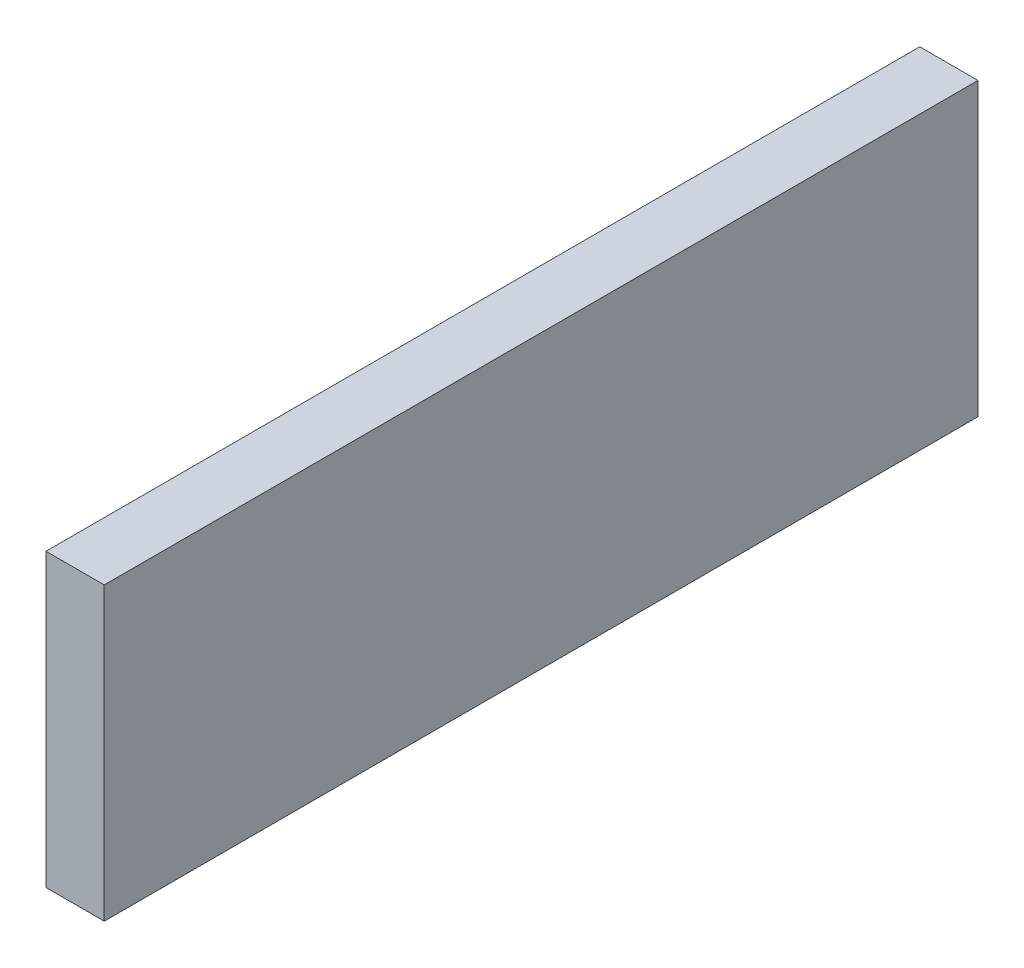
ISO-10303-21;
HEADER;
FILE_DESCRIPTION(('STEP AP214'),'2;1');
FILE_NAME('part.step','',(''),(''),'','','');
FILE_SCHEMA(('AUTOMOTIVE_DESIGN { 1 0 10303 214 1 1 1 1 }'));
ENDSEC;
DATA;
#1=APPLICATION_CONTEXT('core data for automotive mechanical design processes');
#2=APPLICATION_PROTOCOL_DEFINITION('international standard','automotive_design',2000,#1);
#3=PRODUCT_CONTEXT('',#1,'mechanical');
#4=PRODUCT('Part','Part','',(#3));
#5=PRODUCT_RELATED_PRODUCT_CATEGORY('part','',(#4));
#6=PRODUCT_DEFINITION_FORMATION('','',#4);
#7=PRODUCT_DEFINITION_CONTEXT('part definition',#1,'design');
#8=PRODUCT_DEFINITION('design','',#6,#7);
#9=PRODUCT_DEFINITION_SHAPE('','',#8);
#10=(LENGTH_UNIT() NAMED_UNIT(*) SI_UNIT(.MILLI.,.METRE.));
#11=(NAMED_UNIT(*) PLANE_ANGLE_UNIT() SI_UNIT($,.RADIAN.));
#12=(NAMED_UNIT(*) SI_UNIT($,.STERADIAN.) SOLID_ANGLE_UNIT());
#13=UNCERTAINTY_MEASURE_WITH_UNIT(LENGTH_MEASURE(1.E-05),#10,'distance_accuracy_value','');
#14=(GEOMETRIC_REPRESENTATION_CONTEXT(3) GLOBAL_UNCERTAINTY_ASSIGNED_CONTEXT((#13)) GLOBAL_UNIT_ASSIGNED_CONTEXT((#10,
#11,#12)) REPRESENTATION_CONTEXT('',''));
#15=CARTESIAN_POINT('',(0.,0.,0.));
#16=DIRECTION('',(0.,0.,1.));
#17=DIRECTION('',(1.,0.,0.));
#18=AXIS2_PLACEMENT_3D('',#15,#16,#17);
#19=CARTESIAN_POINT('',(0.,100.,0.));
#20=DIRECTION('',(1.,0.,0.));
#21=DIRECTION('',(0.,0.,-1.));
#22=AXIS2_PLACEMENT_3D('',#19,#20,#21);
#23=PLANE('',#22);
#24=DIRECTION('',(0.,0.,1.));
#25=VECTOR('',#24,1.);
#26=CARTESIAN_POINT('',(0.,0.,0.));
#27=LINE('',#26,#25);
#28=CARTESIAN_POINT('',(0.,0.,0.));
#29=VERTEX_POINT('',#28);
#30=CARTESIAN_POINT('',(0.,0.,300.));
#31=VERTEX_POINT('',#30);
#32=EDGE_CURVE('E107',#29,#31,#27,.T.);
#33=ORIENTED_EDGE('',*,*,#32,.T.);
#34=DIRECTION('',(0.,-1.,0.));
#35=VECTOR('',#34,1.);
#36=CARTESIAN_POINT('',(0.,100.,300.));
#37=LINE('',#36,#35);
#38=CARTESIAN_POINT('',(0.,100.,300.));
#39=VERTEX_POINT('',#38);
#40=EDGE_CURVE('E11',#39,#31,#37,.T.);
#41=ORIENTED_EDGE('',*,*,#40,.F.);
#42=DIRECTION('',(0.,0.,1.));
#43=VECTOR('',#42,1.);
#44=CARTESIAN_POINT('',(0.,100.,0.));
#45=LINE('',#44,#43);
#46=CARTESIAN_POINT('',(0.,100.,0.));
#47=VERTEX_POINT('',#46);
#48=EDGE_CURVE('E91',#47,#39,#45,.T.);
#49=ORIENTED_EDGE('',*,*,#48,.F.);
#50=DIRECTION('',(0.,-1.,0.));
#51=VECTOR('',#50,1.);
#52=CARTESIAN_POINT('',(0.,100.,0.));
#53=LINE('',#52,#51);
#54=EDGE_CURVE('E103',#47,#29,#53,.T.);
#55=ORIENTED_EDGE('',*,*,#54,.T.);
#56=EDGE_LOOP('',(#33,#41,#49,#55));
#57=FACE_BOUND('',#56,.T.);
#58=ADVANCED_FACE('F39',(#57),#23,.F.);
#59=CARTESIAN_POINT('',(0.,100.,300.));
#60=DIRECTION('',(0.,0.,-1.));
#61=DIRECTION('',(-1.,0.,0.));
#62=AXIS2_PLACEMENT_3D('',#59,#60,#61);
#63=PLANE('',#62);
#64=DIRECTION('',(1.,0.,0.));
#65=VECTOR('',#64,1.);
#66=CARTESIAN_POINT('',(0.,0.,300.));
#67=LINE('',#66,#65);
#68=CARTESIAN_POINT('',(20.0000000000001,0.,300.));
#69=VERTEX_POINT('',#68);
#70=EDGE_CURVE('E96',#31,#69,#67,.T.);
#71=ORIENTED_EDGE('',*,*,#70,.T.);
#72=DIRECTION('',(0.,-1.,0.));
#73=VECTOR('',#72,1.);
#74=CARTESIAN_POINT('',(20.0000000000001,100.,300.));
#75=LINE('',#74,#73);
#76=CARTESIAN_POINT('',(20.0000000000001,100.,300.));
#77=VERTEX_POINT('',#76);
#78=EDGE_CURVE('E48',#77,#69,#75,.T.);
#79=ORIENTED_EDGE('',*,*,#78,.F.);
#80=DIRECTION('',(1.,0.,0.));
#81=VECTOR('',#80,1.);
#82=CARTESIAN_POINT('',(0.,100.,300.));
#83=LINE('',#82,#81);
#84=EDGE_CURVE('E86',#39,#77,#83,.T.);
#85=ORIENTED_EDGE('',*,*,#84,.F.);
#86=ORIENTED_EDGE('',*,*,#40,.T.);
#87=EDGE_LOOP('',(#71,#79,#85,#86));
#88=FACE_BOUND('',#87,.T.);
#89=ADVANCED_FACE('F95',(#88),#63,.F.);
#90=CARTESIAN_POINT('',(20.,100.,0.));
#91=DIRECTION('',(-1.,0.,0.));
#92=DIRECTION('',(0.,0.,1.));
#93=AXIS2_PLACEMENT_3D('',#90,#91,#92);
#94=PLANE('',#93);
#95=DIRECTION('',(0.,0.,-1.));
#96=VECTOR('',#95,1.);
#97=CARTESIAN_POINT('',(20.,0.,0.));
#98=LINE('',#97,#96);
#99=CARTESIAN_POINT('',(20.,0.,0.));
#100=VERTEX_POINT('',#99);
#101=EDGE_CURVE('E73',#69,#100,#98,.T.);
#102=ORIENTED_EDGE('',*,*,#101,.T.);
#103=DIRECTION('',(0.,-1.,0.));
#104=VECTOR('',#103,1.);
#105=CARTESIAN_POINT('',(20.,100.,0.));
#106=LINE('',#105,#104);
#107=CARTESIAN_POINT('',(20.,100.,0.));
#108=VERTEX_POINT('',#107);
#109=EDGE_CURVE('E98',#108,#100,#106,.T.);
#110=ORIENTED_EDGE('',*,*,#109,.F.);
#111=DIRECTION('',(0.,0.,-1.));
#112=VECTOR('',#111,1.);
#113=CARTESIAN_POINT('',(20.,100.,0.));
#114=LINE('',#113,#112);
#115=EDGE_CURVE('E89',#77,#108,#114,.T.);
#116=ORIENTED_EDGE('',*,*,#115,.F.);
#117=ORIENTED_EDGE('',*,*,#78,.T.);
#118=EDGE_LOOP('',(#102,#110,#116,#117));
#119=FACE_BOUND('',#118,.T.);
#120=ADVANCED_FACE('F99',(#119),#94,.F.);
#121=CARTESIAN_POINT('',(0.,100.,0.));
#122=DIRECTION('',(0.,0.,1.));
#123=DIRECTION('',(1.,0.,0.));
#124=AXIS2_PLACEMENT_3D('',#121,#122,#123);
#125=PLANE('',#124);
#126=DIRECTION('',(-1.,0.,0.));
#127=VECTOR('',#126,1.);
#128=CARTESIAN_POINT('',(0.,0.,0.));
#129=LINE('',#128,#127);
#130=EDGE_CURVE('E79',#100,#29,#129,.T.);
#131=ORIENTED_EDGE('',*,*,#130,.T.);
#132=ORIENTED_EDGE('',*,*,#54,.F.);
#133=DIRECTION('',(-1.,0.,0.));
#134=VECTOR('',#133,1.);
#135=CARTESIAN_POINT('',(0.,100.,0.));
#136=LINE('',#135,#134);
#137=EDGE_CURVE('E56',#108,#47,#136,.T.);
#138=ORIENTED_EDGE('',*,*,#137,.F.);
#139=ORIENTED_EDGE('',*,*,#109,.T.);
#140=EDGE_LOOP('',(#131,#132,#138,#139));
#141=FACE_BOUND('',#140,.T.);
#142=ADVANCED_FACE('F120',(#141),#125,.F.);
#143=CARTESIAN_POINT('',(0.,100.,0.));
#144=DIRECTION('',(0.,1.,0.));
#145=DIRECTION('',(0.,0.,1.));
#146=AXIS2_PLACEMENT_3D('',#143,#144,#145);
#147=PLANE('',#146);
#148=ORIENTED_EDGE('',*,*,#48,.T.);
#149=ORIENTED_EDGE('',*,*,#84,.T.);
#150=ORIENTED_EDGE('',*,*,#115,.T.);
#151=ORIENTED_EDGE('',*,*,#137,.T.);
#152=EDGE_LOOP('',(#148,#149,#150,#151));
#153=FACE_BOUND('',#152,.T.);
#154=ADVANCED_FACE('F87',(#153),#147,.T.);
#155=CARTESIAN_POINT('',(0.,0.,0.));
#156=DIRECTION('',(0.,1.,0.));
#157=DIRECTION('',(0.,0.,1.));
#158=AXIS2_PLACEMENT_3D('',#155,#156,#157);
#159=PLANE('',#158);
#160=ORIENTED_EDGE('',*,*,#32,.F.);
#161=ORIENTED_EDGE('',*,*,#130,.F.);
#162=ORIENTED_EDGE('',*,*,#101,.F.);
#163=ORIENTED_EDGE('',*,*,#70,.F.);
#164=EDGE_LOOP('',(#160,#161,#162,#163));
#165=FACE_BOUND('',#164,.T.);
#166=ADVANCED_FACE('F123',(#165),#159,.F.);
#167=CLOSED_SHELL('',(#58,#89,#120,#142,#154,#166));
#168=MANIFOLD_SOLID_BREP('B2',#167);
#169=ADVANCED_BREP_SHAPE_REPRESENTATION('',(#18,#168),#14);
#170=SHAPE_DEFINITION_REPRESENTATION(#9,#169);
ENDSEC;
END-ISO-10303-21;
